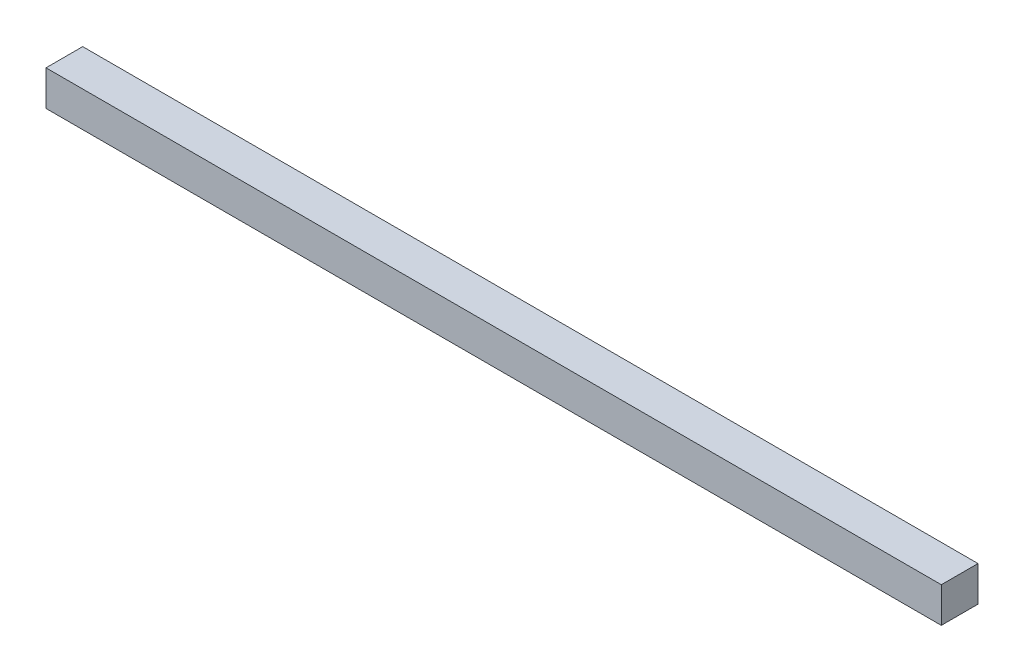
ISO-10303-21;
HEADER;
FILE_DESCRIPTION(('STEP AP214'),'2;1');
FILE_NAME('part.step','',(''),(''),'','','');
FILE_SCHEMA(('AUTOMOTIVE_DESIGN { 1 0 10303 214 1 1 1 1 }'));
ENDSEC;
DATA;
#1=APPLICATION_CONTEXT('core data for automotive mechanical design processes');
#2=APPLICATION_PROTOCOL_DEFINITION('international standard','automotive_design',2000,#1);
#3=PRODUCT_CONTEXT('',#1,'mechanical');
#4=PRODUCT('Part','Part','',(#3));
#5=PRODUCT_RELATED_PRODUCT_CATEGORY('part','',(#4));
#6=PRODUCT_DEFINITION_FORMATION('','',#4);
#7=PRODUCT_DEFINITION_CONTEXT('part definition',#1,'design');
#8=PRODUCT_DEFINITION('design','',#6,#7);
#9=PRODUCT_DEFINITION_SHAPE('','',#8);
#10=(LENGTH_UNIT() NAMED_UNIT(*) SI_UNIT(.MILLI.,.METRE.));
#11=(NAMED_UNIT(*) PLANE_ANGLE_UNIT() SI_UNIT($,.RADIAN.));
#12=(NAMED_UNIT(*) SI_UNIT($,.STERADIAN.) SOLID_ANGLE_UNIT());
#13=UNCERTAINTY_MEASURE_WITH_UNIT(LENGTH_MEASURE(1.E-05),#10,'distance_accuracy_value','');
#14=(GEOMETRIC_REPRESENTATION_CONTEXT(3) GLOBAL_UNCERTAINTY_ASSIGNED_CONTEXT((#13)) GLOBAL_UNIT_ASSIGNED_CONTEXT((#10,
#11,#12)) REPRESENTATION_CONTEXT('',''));
#15=CARTESIAN_POINT('',(0.,0.,0.));
#16=DIRECTION('',(0.,0.,1.));
#17=DIRECTION('',(1.,0.,0.));
#18=AXIS2_PLACEMENT_3D('',#15,#16,#17);
#19=CARTESIAN_POINT('',(-152.5,0.,0.));
#20=DIRECTION('',(1.,0.,0.));
#21=DIRECTION('',(0.,0.,-1.));
#22=AXIS2_PLACEMENT_3D('',#19,#20,#21);
#23=PLANE('',#22);
#24=DIRECTION('',(0.,-1.,0.));
#25=VECTOR('',#24,1.);
#26=CARTESIAN_POINT('',(-152.5,12.,125.));
#27=LINE('',#26,#25);
#28=CARTESIAN_POINT('',(-152.5,12.,125.));
#29=VERTEX_POINT('',#28);
#30=CARTESIAN_POINT('',(-152.5,0.,125.));
#31=VERTEX_POINT('',#30);
#32=EDGE_CURVE('E95',#29,#31,#27,.T.);
#33=ORIENTED_EDGE('',*,*,#32,.T.);
#34=DIRECTION('',(0.,0.,1.));
#35=VECTOR('',#34,1.);
#36=CARTESIAN_POINT('',(-152.5,0.,-137.5));
#37=LINE('',#36,#35);
#38=CARTESIAN_POINT('',(-152.5,0.,137.5));
#39=VERTEX_POINT('',#38);
#40=EDGE_CURVE('E91',#31,#39,#37,.T.);
#41=ORIENTED_EDGE('',*,*,#40,.T.);
#42=DIRECTION('',(0.,-1.,0.));
#43=VECTOR('',#42,1.);
#44=CARTESIAN_POINT('',(-152.5,12.,137.5));
#45=LINE('',#44,#43);
#46=CARTESIAN_POINT('',(-152.5,12.,137.5));
#47=VERTEX_POINT('',#46);
#48=EDGE_CURVE('E94',#47,#39,#45,.T.);
#49=ORIENTED_EDGE('',*,*,#48,.F.);
#50=DIRECTION('',(0.,0.,1.));
#51=VECTOR('',#50,1.);
#52=CARTESIAN_POINT('',(-152.5,12.,137.5));
#53=LINE('',#52,#51);
#54=EDGE_CURVE('E52',#29,#47,#53,.T.);
#55=ORIENTED_EDGE('',*,*,#54,.F.);
#56=EDGE_LOOP('',(#33,#41,#49,#55));
#57=FACE_BOUND('',#56,.T.);
#58=ADVANCED_FACE('F37',(#57),#23,.F.);
#59=CARTESIAN_POINT('',(-152.5,12.,125.));
#60=DIRECTION('',(0.,0.,-1.));
#61=DIRECTION('',(-1.,0.,0.));
#62=AXIS2_PLACEMENT_3D('',#59,#60,#61);
#63=PLANE('',#62);
#64=DIRECTION('',(1.,0.,0.));
#65=VECTOR('',#64,1.);
#66=CARTESIAN_POINT('',(-152.5,0.,125.));
#67=LINE('',#66,#65);
#68=CARTESIAN_POINT('',(152.5,0.,125.));
#69=VERTEX_POINT('',#68);
#70=EDGE_CURVE('E90',#31,#69,#67,.T.);
#71=ORIENTED_EDGE('',*,*,#70,.F.);
#72=ORIENTED_EDGE('',*,*,#32,.F.);
#73=DIRECTION('',(1.,0.,0.));
#74=VECTOR('',#73,1.);
#75=CARTESIAN_POINT('',(-152.5,12.,125.));
#76=LINE('',#75,#74);
#77=CARTESIAN_POINT('',(152.5,12.,125.));
#78=VERTEX_POINT('',#77);
#79=EDGE_CURVE('E98',#29,#78,#76,.T.);
#80=ORIENTED_EDGE('',*,*,#79,.T.);
#81=DIRECTION('',(0.,-1.,0.));
#82=VECTOR('',#81,1.);
#83=CARTESIAN_POINT('',(152.5,12.,125.));
#84=LINE('',#83,#82);
#85=EDGE_CURVE('E96',#78,#69,#84,.T.);
#86=ORIENTED_EDGE('',*,*,#85,.T.);
#87=EDGE_LOOP('',(#71,#72,#80,#86));
#88=FACE_BOUND('',#87,.T.);
#89=ADVANCED_FACE('F108',(#88),#63,.T.);
#90=CARTESIAN_POINT('',(-165.,12.,137.5));
#91=DIRECTION('',(0.,0.,-1.));
#92=DIRECTION('',(-1.,0.,0.));
#93=AXIS2_PLACEMENT_3D('',#90,#91,#92);
#94=PLANE('',#93);
#95=DIRECTION('',(1.,0.,0.));
#96=VECTOR('',#95,1.);
#97=CARTESIAN_POINT('',(-165.,0.,137.5));
#98=LINE('',#97,#96);
#99=CARTESIAN_POINT('',(152.5,0.,137.5));
#100=VERTEX_POINT('',#99);
#101=EDGE_CURVE('E41',#39,#100,#98,.T.);
#102=ORIENTED_EDGE('',*,*,#101,.T.);
#103=DIRECTION('',(0.,-1.,0.));
#104=VECTOR('',#103,1.);
#105=CARTESIAN_POINT('',(152.5,0.,137.5));
#106=LINE('',#105,#104);
#107=CARTESIAN_POINT('',(152.5,12.,137.5));
#108=VERTEX_POINT('',#107);
#109=EDGE_CURVE('E77',#108,#100,#106,.T.);
#110=ORIENTED_EDGE('',*,*,#109,.F.);
#111=DIRECTION('',(1.,0.,0.));
#112=VECTOR('',#111,1.);
#113=CARTESIAN_POINT('',(-165.,12.,137.5));
#114=LINE('',#113,#112);
#115=EDGE_CURVE('E11',#47,#108,#114,.T.);
#116=ORIENTED_EDGE('',*,*,#115,.F.);
#117=ORIENTED_EDGE('',*,*,#48,.T.);
#118=EDGE_LOOP('',(#102,#110,#116,#117));
#119=FACE_BOUND('',#118,.T.);
#120=ADVANCED_FACE('F39',(#119),#94,.F.);
#121=CARTESIAN_POINT('',(0.,0.,0.));
#122=DIRECTION('',(0.,-1.,0.));
#123=DIRECTION('',(0.,0.,-1.));
#124=AXIS2_PLACEMENT_3D('',#121,#122,#123);
#125=PLANE('',#124);
#126=DIRECTION('',(0.,0.,-1.));
#127=VECTOR('',#126,1.);
#128=CARTESIAN_POINT('',(152.5,0.,137.5));
#129=LINE('',#128,#127);
#130=EDGE_CURVE('E60',#100,#69,#129,.T.);
#131=ORIENTED_EDGE('',*,*,#130,.F.);
#132=ORIENTED_EDGE('',*,*,#101,.F.);
#133=ORIENTED_EDGE('',*,*,#40,.F.);
#134=ORIENTED_EDGE('',*,*,#70,.T.);
#135=EDGE_LOOP('',(#131,#132,#133,#134));
#136=FACE_BOUND('',#135,.T.);
#137=ADVANCED_FACE('F87',(#136),#125,.T.);
#138=CARTESIAN_POINT('',(0.,12.,0.));
#139=DIRECTION('',(0.,-1.,0.));
#140=DIRECTION('',(0.,0.,-1.));
#141=AXIS2_PLACEMENT_3D('',#138,#139,#140);
#142=PLANE('',#141);
#143=DIRECTION('',(0.,0.,-1.));
#144=VECTOR('',#143,1.);
#145=CARTESIAN_POINT('',(152.5,12.,137.5));
#146=LINE('',#145,#144);
#147=EDGE_CURVE('E79',#108,#78,#146,.T.);
#148=ORIENTED_EDGE('',*,*,#147,.T.);
#149=ORIENTED_EDGE('',*,*,#79,.F.);
#150=ORIENTED_EDGE('',*,*,#54,.T.);
#151=ORIENTED_EDGE('',*,*,#115,.T.);
#152=EDGE_LOOP('',(#148,#149,#150,#151));
#153=FACE_BOUND('',#152,.T.);
#154=ADVANCED_FACE('F111',(#153),#142,.F.);
#155=CARTESIAN_POINT('',(152.5,0.,0.));
#156=DIRECTION('',(-1.,0.,0.));
#157=DIRECTION('',(0.,0.,1.));
#158=AXIS2_PLACEMENT_3D('',#155,#156,#157);
#159=PLANE('',#158);
#160=ORIENTED_EDGE('',*,*,#85,.F.);
#161=ORIENTED_EDGE('',*,*,#147,.F.);
#162=ORIENTED_EDGE('',*,*,#109,.T.);
#163=ORIENTED_EDGE('',*,*,#130,.T.);
#164=EDGE_LOOP('',(#160,#161,#162,#163));
#165=FACE_BOUND('',#164,.T.);
#166=ADVANCED_FACE('F78',(#165),#159,.F.);
#167=CLOSED_SHELL('',(#58,#89,#120,#137,#154,#166));
#168=MANIFOLD_SOLID_BREP('B2',#167);
#169=ADVANCED_BREP_SHAPE_REPRESENTATION('',(#18,#168),#14);
#170=SHAPE_DEFINITION_REPRESENTATION(#9,#169);
ENDSEC;
END-ISO-10303-21;
